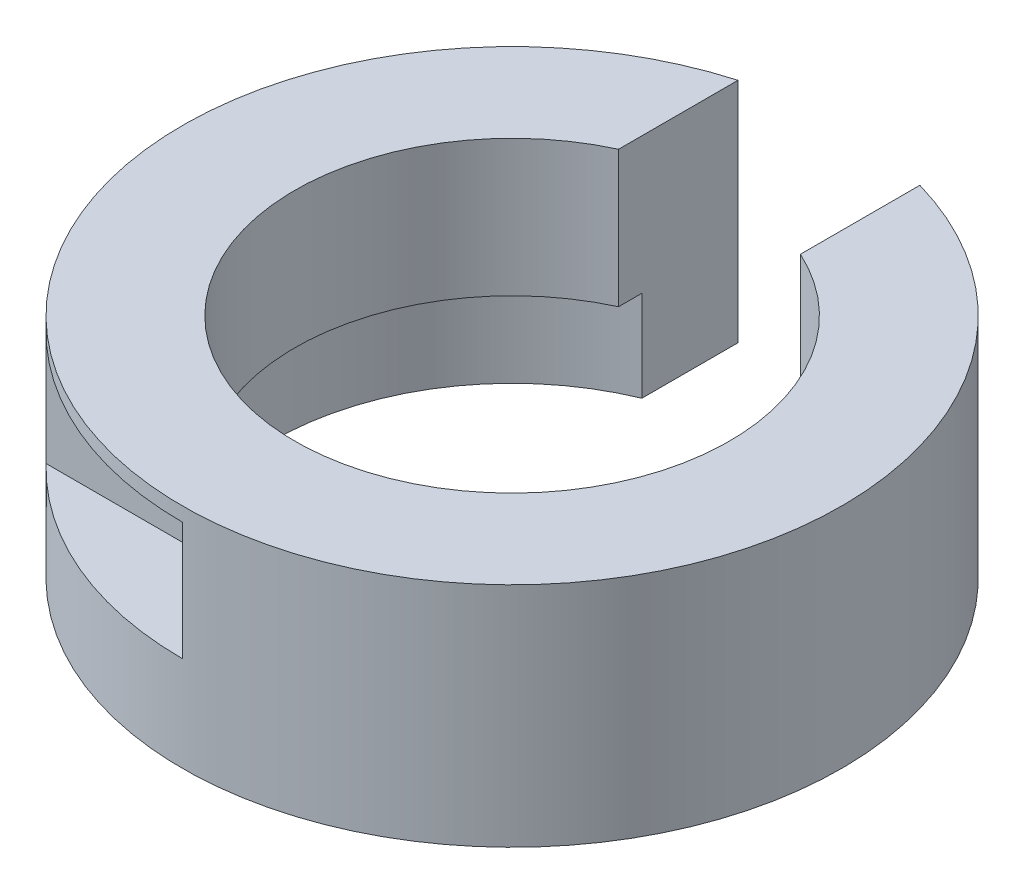
ISO-10303-21;
HEADER;
FILE_DESCRIPTION(('STEP AP214'),'2;1');
FILE_NAME('part.step','',(''),(''),'','','');
FILE_SCHEMA(('AUTOMOTIVE_DESIGN { 1 0 10303 214 1 1 1 1 }'));
ENDSEC;
DATA;
#1=APPLICATION_CONTEXT('core data for automotive mechanical design processes');
#2=APPLICATION_PROTOCOL_DEFINITION('international standard','automotive_design',2000,#1);
#3=PRODUCT_CONTEXT('',#1,'mechanical');
#4=PRODUCT('Part','Part','',(#3));
#5=PRODUCT_RELATED_PRODUCT_CATEGORY('part','',(#4));
#6=PRODUCT_DEFINITION_FORMATION('','',#4);
#7=PRODUCT_DEFINITION_CONTEXT('part definition',#1,'design');
#8=PRODUCT_DEFINITION('design','',#6,#7);
#9=PRODUCT_DEFINITION_SHAPE('','',#8);
#10=(LENGTH_UNIT() NAMED_UNIT(*) SI_UNIT(.MILLI.,.METRE.));
#11=(NAMED_UNIT(*) PLANE_ANGLE_UNIT() SI_UNIT($,.RADIAN.));
#12=(NAMED_UNIT(*) SI_UNIT($,.STERADIAN.) SOLID_ANGLE_UNIT());
#13=UNCERTAINTY_MEASURE_WITH_UNIT(LENGTH_MEASURE(1.E-05),#10,'distance_accuracy_value','');
#14=(GEOMETRIC_REPRESENTATION_CONTEXT(3) GLOBAL_UNCERTAINTY_ASSIGNED_CONTEXT((#13)) GLOBAL_UNIT_ASSIGNED_CONTEXT((#10,
#11,#12)) REPRESENTATION_CONTEXT('',''));
#15=CARTESIAN_POINT('',(0.,0.,0.));
#16=DIRECTION('',(0.,0.,1.));
#17=DIRECTION('',(1.,0.,0.));
#18=AXIS2_PLACEMENT_3D('',#15,#16,#17);
#19=CARTESIAN_POINT('',(0.,50.,0.));
#20=DIRECTION('',(0.,-1.,0.));
#21=DIRECTION('',(0.,0.,-1.));
#22=AXIS2_PLACEMENT_3D('',#19,#20,#21);
#23=CYLINDRICAL_SURFACE('',#22,52.5);
#24=DIRECTION('',(0.,-1.,0.));
#25=VECTOR('',#24,1.);
#26=CARTESIAN_POINT('',(-20.,50.,-48.541219597369));
#27=LINE('',#26,#25);
#28=CARTESIAN_POINT('',(-20.,20.,-48.541219597369));
#29=VERTEX_POINT('',#28);
#30=CARTESIAN_POINT('',(-20.,0.,-48.541219597369));
#31=VERTEX_POINT('',#30);
#32=EDGE_CURVE('E194',#29,#31,#27,.T.);
#33=ORIENTED_EDGE('',*,*,#32,.F.);
#34=CARTESIAN_POINT('',(0.,20.,0.));
#35=DIRECTION('',(0.,1.,0.));
#36=DIRECTION('',(0.,0.,1.));
#37=AXIS2_PLACEMENT_3D('',#34,#35,#36);
#38=CIRCLE('',#37,52.5);
#39=CARTESIAN_POINT('',(20.,20.,-48.541219597369));
#40=VERTEX_POINT('',#39);
#41=EDGE_CURVE('E157',#29,#40,#38,.T.);
#42=ORIENTED_EDGE('',*,*,#41,.T.);
#43=DIRECTION('',(0.,-1.,0.));
#44=VECTOR('',#43,1.);
#45=CARTESIAN_POINT('',(20.,50.,-48.541219597369));
#46=LINE('',#45,#44);
#47=CARTESIAN_POINT('',(20.,0.,-48.541219597369));
#48=VERTEX_POINT('',#47);
#49=EDGE_CURVE('E200',#48,#40,#46,.F.);
#50=ORIENTED_EDGE('',*,*,#49,.F.);
#51=CARTESIAN_POINT('',(0.,0.,0.));
#52=DIRECTION('',(0.,1.,0.));
#53=DIRECTION('',(0.,0.,1.));
#54=AXIS2_PLACEMENT_3D('',#51,#52,#53);
#55=CIRCLE('',#54,52.5);
#56=EDGE_CURVE('E185',#31,#48,#55,.T.);
#57=ORIENTED_EDGE('',*,*,#56,.F.);
#58=EDGE_LOOP('',(#33,#42,#50,#57));
#59=FACE_BOUND('',#58,.T.);
#60=ADVANCED_FACE('F46',(#59),#23,.F.);
#61=CARTESIAN_POINT('',(0.,50.,0.));
#62=DIRECTION('',(0.,1.,0.));
#63=DIRECTION('',(0.,0.,1.));
#64=AXIS2_PLACEMENT_3D('',#61,#62,#63);
#65=PLANE('',#64);
#66=DIRECTION('',(0.,0.,-1.));
#67=VECTOR('',#66,1.);
#68=CARTESIAN_POINT('',(20.,50.,0.));
#69=LINE('',#68,#67);
#70=CARTESIAN_POINT('',(20.,50.,-43.4147440393238));
#71=VERTEX_POINT('',#70);
#72=CARTESIAN_POINT('',(20.,50.,-69.6867993238318));
#73=VERTEX_POINT('',#72);
#74=EDGE_CURVE('E178',#71,#73,#69,.T.);
#75=ORIENTED_EDGE('',*,*,#74,.F.);
#76=CARTESIAN_POINT('',(0.,50.,0.));
#77=DIRECTION('',(0.,1.,0.));
#78=DIRECTION('',(0.,0.,1.));
#79=AXIS2_PLACEMENT_3D('',#76,#77,#78);
#80=CIRCLE('',#79,47.8);
#81=CARTESIAN_POINT('',(-20.,50.,-43.4147440393238));
#82=VERTEX_POINT('',#81);
#83=EDGE_CURVE('E152',#82,#71,#80,.T.);
#84=ORIENTED_EDGE('',*,*,#83,.F.);
#85=DIRECTION('',(0.,0.,1.));
#86=VECTOR('',#85,1.);
#87=CARTESIAN_POINT('',(-20.,50.,0.));
#88=LINE('',#87,#86);
#89=CARTESIAN_POINT('',(-20.,50.,-69.6867993238318));
#90=VERTEX_POINT('',#89);
#91=EDGE_CURVE('E70',#90,#82,#88,.T.);
#92=ORIENTED_EDGE('',*,*,#91,.F.);
#93=CARTESIAN_POINT('',(0.,50.,0.));
#94=DIRECTION('',(0.,1.,0.));
#95=DIRECTION('',(0.,0.,1.));
#96=AXIS2_PLACEMENT_3D('',#93,#94,#95);
#97=CIRCLE('',#96,72.5);
#98=EDGE_CURVE('E190',#90,#73,#97,.T.);
#99=ORIENTED_EDGE('',*,*,#98,.T.);
#100=EDGE_LOOP('',(#75,#84,#92,#99));
#101=FACE_BOUND('',#100,.T.);
#102=ADVANCED_FACE('F233',(#101),#65,.T.);
#103=CARTESIAN_POINT('',(0.,0.,0.));
#104=DIRECTION('',(0.,1.,0.));
#105=DIRECTION('',(0.,0.,1.));
#106=AXIS2_PLACEMENT_3D('',#103,#104,#105);
#107=PLANE('',#106);
#108=ORIENTED_EDGE('',*,*,#56,.T.);
#109=DIRECTION('',(0.,0.,-1.));
#110=VECTOR('',#109,1.);
#111=CARTESIAN_POINT('',(20.,0.,0.));
#112=LINE('',#111,#110);
#113=CARTESIAN_POINT('',(20.,0.,-69.6867993238318));
#114=VERTEX_POINT('',#113);
#115=EDGE_CURVE('E164',#48,#114,#112,.T.);
#116=ORIENTED_EDGE('',*,*,#115,.T.);
#117=CARTESIAN_POINT('',(0.,0.,0.));
#118=DIRECTION('',(0.,1.,0.));
#119=DIRECTION('',(0.,0.,1.));
#120=AXIS2_PLACEMENT_3D('',#117,#118,#119);
#121=CIRCLE('',#120,72.5);
#122=CARTESIAN_POINT('',(-20.,0.,-69.6867993238318));
#123=VERTEX_POINT('',#122);
#124=EDGE_CURVE('E189',#123,#114,#121,.T.);
#125=ORIENTED_EDGE('',*,*,#124,.F.);
#126=DIRECTION('',(0.,0.,1.));
#127=VECTOR('',#126,1.);
#128=CARTESIAN_POINT('',(-20.,0.,0.));
#129=LINE('',#128,#127);
#130=EDGE_CURVE('E168',#123,#31,#129,.T.);
#131=ORIENTED_EDGE('',*,*,#130,.T.);
#132=EDGE_LOOP('',(#108,#116,#125,#131));
#133=FACE_BOUND('',#132,.T.);
#134=ADVANCED_FACE('F239',(#133),#107,.F.);
#135=CARTESIAN_POINT('',(0.,50.,0.));
#136=DIRECTION('',(0.,-1.,0.));
#137=DIRECTION('',(0.,0.,-1.));
#138=AXIS2_PLACEMENT_3D('',#135,#136,#137);
#139=CYLINDRICAL_SURFACE('',#138,72.5);
#140=DIRECTION('',(0.,-1.,0.));
#141=VECTOR('',#140,1.);
#142=CARTESIAN_POINT('',(-52.1897216166709,50.,50.3237812328763));
#143=LINE('',#142,#141);
#144=CARTESIAN_POINT('',(-52.1897216166709,20.9049902179928,50.3237812328763));
#145=VERTEX_POINT('',#144);
#146=CARTESIAN_POINT('',(-52.1897216166709,46.9049902179927,50.3237812328763));
#147=VERTEX_POINT('',#146);
#148=EDGE_CURVE('E55',#145,#147,#143,.F.);
#149=ORIENTED_EDGE('',*,*,#148,.T.);
#150=CARTESIAN_POINT('',(0.,46.9049902179927,0.));
#151=DIRECTION('',(0.,1.,0.));
#152=DIRECTION('',(0.,0.,1.));
#153=AXIS2_PLACEMENT_3D('',#150,#151,#152);
#154=CIRCLE('',#153,72.5);
#155=CARTESIAN_POINT('',(0.,46.9049902179927,72.5));
#156=VERTEX_POINT('',#155);
#157=EDGE_CURVE('E12',#147,#156,#154,.T.);
#158=ORIENTED_EDGE('',*,*,#157,.T.);
#159=DIRECTION('',(0.,-1.,0.));
#160=VECTOR('',#159,1.);
#161=CARTESIAN_POINT('',(0.,50.,72.5));
#162=LINE('',#161,#160);
#163=CARTESIAN_POINT('',(0.,20.9049902179927,72.5));
#164=VERTEX_POINT('',#163);
#165=EDGE_CURVE('E211',#164,#156,#162,.F.);
#166=ORIENTED_EDGE('',*,*,#165,.F.);
#167=CARTESIAN_POINT('',(0.,20.9049902179928,0.));
#168=DIRECTION('',(0.,-1.,0.));
#169=DIRECTION('',(0.,0.,-1.));
#170=AXIS2_PLACEMENT_3D('',#167,#168,#169);
#171=CIRCLE('',#170,72.5);
#172=EDGE_CURVE('E132',#164,#145,#171,.T.);
#173=ORIENTED_EDGE('',*,*,#172,.T.);
#174=EDGE_LOOP('',(#149,#158,#166,#173));
#175=FACE_BOUND('',#174,.T.);
#176=ORIENTED_EDGE('',*,*,#124,.T.);
#177=DIRECTION('',(0.,-1.,0.));
#178=VECTOR('',#177,1.);
#179=CARTESIAN_POINT('',(20.,50.,-69.6867993238318));
#180=LINE('',#179,#178);
#181=EDGE_CURVE('E181',#114,#73,#180,.F.);
#182=ORIENTED_EDGE('',*,*,#181,.T.);
#183=ORIENTED_EDGE('',*,*,#98,.F.);
#184=DIRECTION('',(0.,-1.,0.));
#185=VECTOR('',#184,1.);
#186=CARTESIAN_POINT('',(-20.,50.,-69.6867993238318));
#187=LINE('',#186,#185);
#188=EDGE_CURVE('E174',#90,#123,#187,.T.);
#189=ORIENTED_EDGE('',*,*,#188,.T.);
#190=EDGE_LOOP('',(#176,#182,#183,#189));
#191=FACE_BOUND('',#190,.T.);
#192=ADVANCED_FACE('F48',(#175,#191),#139,.T.);
#193=CARTESIAN_POINT('',(-20.,0.,0.));
#194=DIRECTION('',(-1.,0.,0.));
#195=DIRECTION('',(0.,0.,1.));
#196=AXIS2_PLACEMENT_3D('',#193,#194,#195);
#197=PLANE('',#196);
#198=ORIENTED_EDGE('',*,*,#91,.T.);
#199=DIRECTION('',(0.,1.,0.));
#200=VECTOR('',#199,1.);
#201=CARTESIAN_POINT('',(-20.,20.,-43.4147440393238));
#202=LINE('',#201,#200);
#203=CARTESIAN_POINT('',(-20.,20.,-43.4147440393238));
#204=VERTEX_POINT('',#203);
#205=EDGE_CURVE('E204',#204,#82,#202,.T.);
#206=ORIENTED_EDGE('',*,*,#205,.F.);
#207=DIRECTION('',(0.,0.,1.));
#208=VECTOR('',#207,1.);
#209=CARTESIAN_POINT('',(-20.,20.,0.));
#210=LINE('',#209,#208);
#211=EDGE_CURVE('E144',#29,#204,#210,.T.);
#212=ORIENTED_EDGE('',*,*,#211,.F.);
#213=ORIENTED_EDGE('',*,*,#32,.T.);
#214=ORIENTED_EDGE('',*,*,#130,.F.);
#215=ORIENTED_EDGE('',*,*,#188,.F.);
#216=EDGE_LOOP('',(#198,#206,#212,#213,#214,#215));
#217=FACE_BOUND('',#216,.T.);
#218=ADVANCED_FACE('F252',(#217),#197,.F.);
#219=CARTESIAN_POINT('',(20.,0.,0.));
#220=DIRECTION('',(1.,0.,0.));
#221=DIRECTION('',(0.,0.,-1.));
#222=AXIS2_PLACEMENT_3D('',#219,#220,#221);
#223=PLANE('',#222);
#224=ORIENTED_EDGE('',*,*,#115,.F.);
#225=ORIENTED_EDGE('',*,*,#49,.T.);
#226=DIRECTION('',(0.,0.,-1.));
#227=VECTOR('',#226,1.);
#228=CARTESIAN_POINT('',(20.,20.,0.));
#229=LINE('',#228,#227);
#230=CARTESIAN_POINT('',(20.,20.,-43.4147440393238));
#231=VERTEX_POINT('',#230);
#232=EDGE_CURVE('E149',#231,#40,#229,.T.);
#233=ORIENTED_EDGE('',*,*,#232,.F.);
#234=DIRECTION('',(0.,1.,0.));
#235=VECTOR('',#234,1.);
#236=CARTESIAN_POINT('',(20.,20.,-43.4147440393238));
#237=LINE('',#236,#235);
#238=EDGE_CURVE('E207',#71,#231,#237,.F.);
#239=ORIENTED_EDGE('',*,*,#238,.F.);
#240=ORIENTED_EDGE('',*,*,#74,.T.);
#241=ORIENTED_EDGE('',*,*,#181,.F.);
#242=EDGE_LOOP('',(#224,#225,#233,#239,#240,#241));
#243=FACE_BOUND('',#242,.T.);
#244=ADVANCED_FACE('F244',(#243),#223,.F.);
#245=CARTESIAN_POINT('',(0.,20.,0.));
#246=DIRECTION('',(0.,1.,0.));
#247=DIRECTION('',(0.,0.,1.));
#248=AXIS2_PLACEMENT_3D('',#245,#246,#247);
#249=PLANE('',#248);
#250=CARTESIAN_POINT('',(0.,20.,0.));
#251=DIRECTION('',(0.,1.,0.));
#252=DIRECTION('',(0.,0.,1.));
#253=AXIS2_PLACEMENT_3D('',#250,#251,#252);
#254=CIRCLE('',#253,47.8);
#255=EDGE_CURVE('E153',#204,#231,#254,.T.);
#256=ORIENTED_EDGE('',*,*,#255,.T.);
#257=ORIENTED_EDGE('',*,*,#232,.T.);
#258=ORIENTED_EDGE('',*,*,#41,.F.);
#259=ORIENTED_EDGE('',*,*,#211,.T.);
#260=EDGE_LOOP('',(#256,#257,#258,#259));
#261=FACE_BOUND('',#260,.T.);
#262=ADVANCED_FACE('F228',(#261),#249,.F.);
#263=CARTESIAN_POINT('',(0.,20.,0.));
#264=DIRECTION('',(0.,1.,0.));
#265=DIRECTION('',(0.,0.,1.));
#266=AXIS2_PLACEMENT_3D('',#263,#264,#265);
#267=CYLINDRICAL_SURFACE('',#266,47.8);
#268=ORIENTED_EDGE('',*,*,#83,.T.);
#269=ORIENTED_EDGE('',*,*,#238,.T.);
#270=ORIENTED_EDGE('',*,*,#255,.F.);
#271=ORIENTED_EDGE('',*,*,#205,.T.);
#272=EDGE_LOOP('',(#268,#269,#270,#271));
#273=FACE_BOUND('',#272,.T.);
#274=ADVANCED_FACE('F221',(#273),#267,.F.);
#275=CARTESIAN_POINT('',(-72.5,46.9049902179927,73.4675470318393));
#276=DIRECTION('',(0.,1.,0.));
#277=DIRECTION('',(0.,0.,1.));
#278=AXIS2_PLACEMENT_3D('',#275,#276,#277);
#279=PLANE('',#278);
#280=DIRECTION('',(1.,0.,0.));
#281=VECTOR('',#280,1.);
#282=CARTESIAN_POINT('',(-72.5,46.9049902179927,50.3237812328763));
#283=LINE('',#282,#281);
#284=CARTESIAN_POINT('',(0.,46.9049902179927,50.3237812328763));
#285=VERTEX_POINT('',#284);
#286=EDGE_CURVE('E128',#147,#285,#283,.T.);
#287=ORIENTED_EDGE('',*,*,#286,.T.);
#288=DIRECTION('',(0.,0.,1.));
#289=VECTOR('',#288,1.);
#290=CARTESIAN_POINT('',(0.,46.9049902179927,73.4675470318393));
#291=LINE('',#290,#289);
#292=EDGE_CURVE('E129',#285,#156,#291,.T.);
#293=ORIENTED_EDGE('',*,*,#292,.T.);
#294=ORIENTED_EDGE('',*,*,#157,.F.);
#295=EDGE_LOOP('',(#287,#293,#294));
#296=FACE_BOUND('',#295,.T.);
#297=ADVANCED_FACE('F219',(#296),#279,.F.);
#298=CARTESIAN_POINT('',(-72.5,46.9049902179927,50.3237812328763));
#299=DIRECTION('',(0.,0.,-1.));
#300=DIRECTION('',(-1.,0.,0.));
#301=AXIS2_PLACEMENT_3D('',#298,#299,#300);
#302=PLANE('',#301);
#303=DIRECTION('',(1.,0.,0.));
#304=VECTOR('',#303,1.);
#305=CARTESIAN_POINT('',(-72.5,20.9049902179928,50.3237812328763));
#306=LINE('',#305,#304);
#307=CARTESIAN_POINT('',(0.,20.9049902179928,50.3237812328763));
#308=VERTEX_POINT('',#307);
#309=EDGE_CURVE('E119',#145,#308,#306,.T.);
#310=ORIENTED_EDGE('',*,*,#309,.T.);
#311=DIRECTION('',(0.,1.,0.));
#312=VECTOR('',#311,1.);
#313=CARTESIAN_POINT('',(0.,46.9049902179927,50.3237812328763));
#314=LINE('',#313,#312);
#315=EDGE_CURVE('E122',#308,#285,#314,.T.);
#316=ORIENTED_EDGE('',*,*,#315,.T.);
#317=ORIENTED_EDGE('',*,*,#286,.F.);
#318=ORIENTED_EDGE('',*,*,#148,.F.);
#319=EDGE_LOOP('',(#310,#316,#317,#318));
#320=FACE_BOUND('',#319,.T.);
#321=ADVANCED_FACE('F120',(#320),#302,.F.);
#322=CARTESIAN_POINT('',(-72.5,20.9049902179928,50.3237812328763));
#323=DIRECTION('',(0.,-1.,0.));
#324=DIRECTION('',(0.,0.,-1.));
#325=AXIS2_PLACEMENT_3D('',#322,#323,#324);
#326=PLANE('',#325);
#327=DIRECTION('',(0.,0.,-1.));
#328=VECTOR('',#327,1.);
#329=CARTESIAN_POINT('',(0.,20.9049902179928,50.3237812328763));
#330=LINE('',#329,#328);
#331=EDGE_CURVE('E62',#164,#308,#330,.T.);
#332=ORIENTED_EDGE('',*,*,#331,.T.);
#333=ORIENTED_EDGE('',*,*,#309,.F.);
#334=ORIENTED_EDGE('',*,*,#172,.F.);
#335=EDGE_LOOP('',(#332,#333,#334));
#336=FACE_BOUND('',#335,.T.);
#337=ADVANCED_FACE('F131',(#336),#326,.F.);
#338=CARTESIAN_POINT('',(0.,0.,0.));
#339=DIRECTION('',(-1.,0.,0.));
#340=DIRECTION('',(0.,0.,1.));
#341=AXIS2_PLACEMENT_3D('',#338,#339,#340);
#342=PLANE('',#341);
#343=ORIENTED_EDGE('',*,*,#165,.T.);
#344=ORIENTED_EDGE('',*,*,#292,.F.);
#345=ORIENTED_EDGE('',*,*,#315,.F.);
#346=ORIENTED_EDGE('',*,*,#331,.F.);
#347=EDGE_LOOP('',(#343,#344,#345,#346));
#348=FACE_BOUND('',#347,.T.);
#349=ADVANCED_FACE('F136',(#348),#342,.T.);
#350=CLOSED_SHELL('',(#60,#102,#134,#192,#218,#244,#262,#274,#297,#321,#337,#349));
#351=MANIFOLD_SOLID_BREP('B2',#350);
#352=ADVANCED_BREP_SHAPE_REPRESENTATION('',(#18,#351),#14);
#353=SHAPE_DEFINITION_REPRESENTATION(#9,#352);
ENDSEC;
END-ISO-10303-21;
